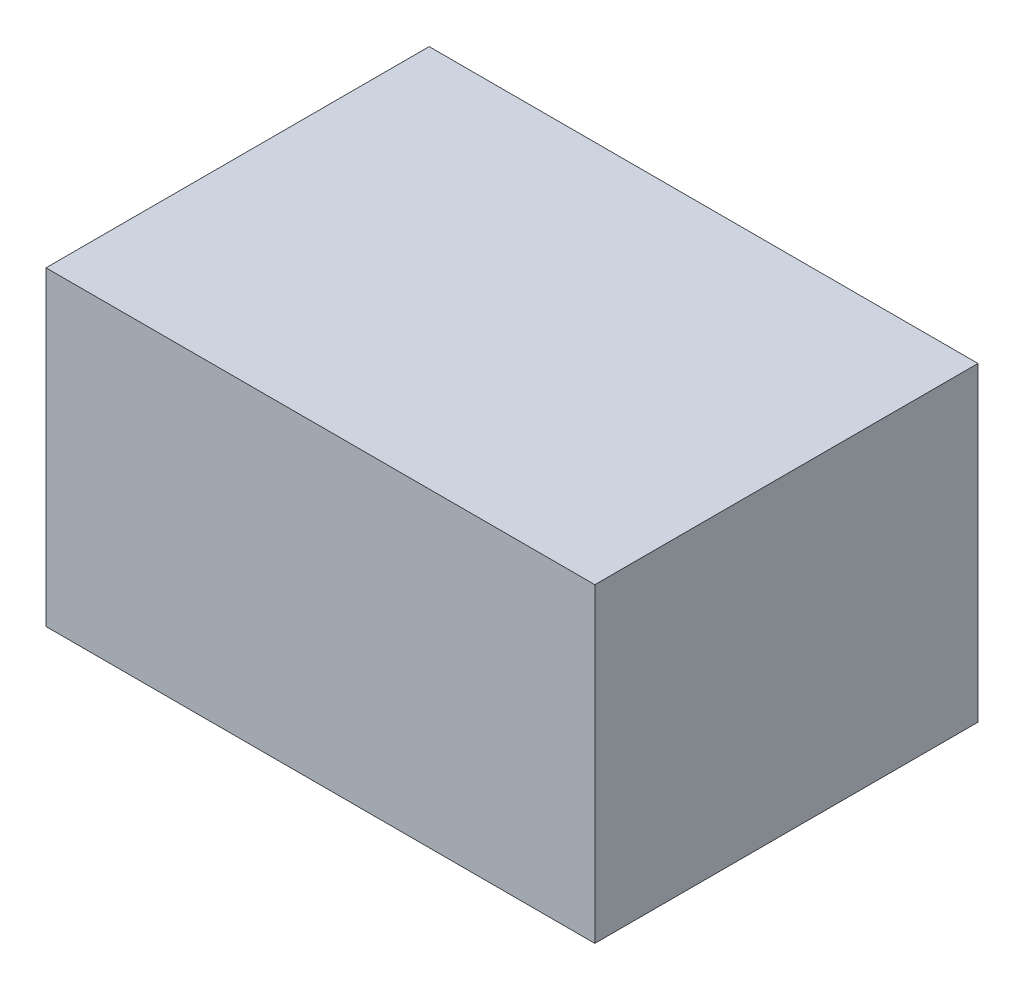
ISO-10303-21;
HEADER;
FILE_DESCRIPTION(('STEP AP214'),'2;1');
FILE_NAME('part.step','',(''),(''),'','','');
FILE_SCHEMA(('AUTOMOTIVE_DESIGN { 1 0 10303 214 1 1 1 1 }'));
ENDSEC;
DATA;
#1=APPLICATION_CONTEXT('core data for automotive mechanical design processes');
#2=APPLICATION_PROTOCOL_DEFINITION('international standard','automotive_design',2000,#1);
#3=PRODUCT_CONTEXT('',#1,'mechanical');
#4=PRODUCT('Part','Part','',(#3));
#5=PRODUCT_RELATED_PRODUCT_CATEGORY('part','',(#4));
#6=PRODUCT_DEFINITION_FORMATION('','',#4);
#7=PRODUCT_DEFINITION_CONTEXT('part definition',#1,'design');
#8=PRODUCT_DEFINITION('design','',#6,#7);
#9=PRODUCT_DEFINITION_SHAPE('','',#8);
#10=(LENGTH_UNIT() NAMED_UNIT(*) SI_UNIT(.MILLI.,.METRE.));
#11=(NAMED_UNIT(*) PLANE_ANGLE_UNIT() SI_UNIT($,.RADIAN.));
#12=(NAMED_UNIT(*) SI_UNIT($,.STERADIAN.) SOLID_ANGLE_UNIT());
#13=UNCERTAINTY_MEASURE_WITH_UNIT(LENGTH_MEASURE(1.E-05),#10,'distance_accuracy_value','');
#14=(GEOMETRIC_REPRESENTATION_CONTEXT(3) GLOBAL_UNCERTAINTY_ASSIGNED_CONTEXT((#13)) GLOBAL_UNIT_ASSIGNED_CONTEXT((#10,
#11,#12)) REPRESENTATION_CONTEXT('',''));
#15=CARTESIAN_POINT('',(0.,0.,0.));
#16=DIRECTION('',(0.,0.,1.));
#17=DIRECTION('',(1.,0.,0.));
#18=AXIS2_PLACEMENT_3D('',#15,#16,#17);
#19=CARTESIAN_POINT('',(132.5,75.,92.5));
#20=DIRECTION('',(-1.,0.,0.));
#21=DIRECTION('',(0.,0.,1.));
#22=AXIS2_PLACEMENT_3D('',#19,#20,#21);
#23=PLANE('',#22);
#24=DIRECTION('',(0.,0.,-1.));
#25=VECTOR('',#24,1.);
#26=CARTESIAN_POINT('',(132.5,-75.,92.5));
#27=LINE('',#26,#25);
#28=CARTESIAN_POINT('',(132.5,-75.,92.5));
#29=VERTEX_POINT('',#28);
#30=CARTESIAN_POINT('',(132.5,-75.,-92.5));
#31=VERTEX_POINT('',#30);
#32=EDGE_CURVE('E96',#29,#31,#27,.T.);
#33=ORIENTED_EDGE('',*,*,#32,.T.);
#34=DIRECTION('',(0.,-1.,0.));
#35=VECTOR('',#34,1.);
#36=CARTESIAN_POINT('',(132.5,75.,-92.5));
#37=LINE('',#36,#35);
#38=CARTESIAN_POINT('',(132.5,75.,-92.5));
#39=VERTEX_POINT('',#38);
#40=EDGE_CURVE('E11',#39,#31,#37,.T.);
#41=ORIENTED_EDGE('',*,*,#40,.F.);
#42=DIRECTION('',(0.,0.,-1.));
#43=VECTOR('',#42,1.);
#44=CARTESIAN_POINT('',(132.5,75.,92.5));
#45=LINE('',#44,#43);
#46=CARTESIAN_POINT('',(132.5,75.,92.5));
#47=VERTEX_POINT('',#46);
#48=EDGE_CURVE('E84',#47,#39,#45,.T.);
#49=ORIENTED_EDGE('',*,*,#48,.F.);
#50=DIRECTION('',(0.,-1.,0.));
#51=VECTOR('',#50,1.);
#52=CARTESIAN_POINT('',(132.5,75.,92.5));
#53=LINE('',#52,#51);
#54=EDGE_CURVE('E92',#47,#29,#53,.T.);
#55=ORIENTED_EDGE('',*,*,#54,.T.);
#56=EDGE_LOOP('',(#33,#41,#49,#55));
#57=FACE_BOUND('',#56,.T.);
#58=ADVANCED_FACE('F33',(#57),#23,.F.);
#59=CARTESIAN_POINT('',(-132.5,75.,-92.5));
#60=DIRECTION('',(0.,0.,1.));
#61=DIRECTION('',(1.,0.,0.));
#62=AXIS2_PLACEMENT_3D('',#59,#60,#61);
#63=PLANE('',#62);
#64=DIRECTION('',(-1.,0.,0.));
#65=VECTOR('',#64,1.);
#66=CARTESIAN_POINT('',(-132.5,-75.,-92.5));
#67=LINE('',#66,#65);
#68=CARTESIAN_POINT('',(-132.5,-75.,-92.5));
#69=VERTEX_POINT('',#68);
#70=EDGE_CURVE('E88',#31,#69,#67,.T.);
#71=ORIENTED_EDGE('',*,*,#70,.T.);
#72=DIRECTION('',(0.,-1.,0.));
#73=VECTOR('',#72,1.);
#74=CARTESIAN_POINT('',(-132.5,75.,-92.5));
#75=LINE('',#74,#73);
#76=CARTESIAN_POINT('',(-132.5,75.,-92.5));
#77=VERTEX_POINT('',#76);
#78=EDGE_CURVE('E41',#77,#69,#75,.T.);
#79=ORIENTED_EDGE('',*,*,#78,.F.);
#80=DIRECTION('',(-1.,0.,0.));
#81=VECTOR('',#80,1.);
#82=CARTESIAN_POINT('',(-132.5,75.,-92.5));
#83=LINE('',#82,#81);
#84=EDGE_CURVE('E79',#39,#77,#83,.T.);
#85=ORIENTED_EDGE('',*,*,#84,.F.);
#86=ORIENTED_EDGE('',*,*,#40,.T.);
#87=EDGE_LOOP('',(#71,#79,#85,#86));
#88=FACE_BOUND('',#87,.T.);
#89=ADVANCED_FACE('F87',(#88),#63,.F.);
#90=CARTESIAN_POINT('',(-132.5,75.,92.5));
#91=DIRECTION('',(1.,0.,0.));
#92=DIRECTION('',(0.,0.,-1.));
#93=AXIS2_PLACEMENT_3D('',#90,#91,#92);
#94=PLANE('',#93);
#95=DIRECTION('',(0.,0.,1.));
#96=VECTOR('',#95,1.);
#97=CARTESIAN_POINT('',(-132.5,-75.,92.5));
#98=LINE('',#97,#96);
#99=CARTESIAN_POINT('',(-132.5,-75.,92.5));
#100=VERTEX_POINT('',#99);
#101=EDGE_CURVE('E66',#69,#100,#98,.T.);
#102=ORIENTED_EDGE('',*,*,#101,.T.);
#103=DIRECTION('',(0.,-1.,0.));
#104=VECTOR('',#103,1.);
#105=CARTESIAN_POINT('',(-132.5,75.,92.5));
#106=LINE('',#105,#104);
#107=CARTESIAN_POINT('',(-132.5,75.,92.5));
#108=VERTEX_POINT('',#107);
#109=EDGE_CURVE('E89',#108,#100,#106,.T.);
#110=ORIENTED_EDGE('',*,*,#109,.F.);
#111=DIRECTION('',(0.,0.,1.));
#112=VECTOR('',#111,1.);
#113=CARTESIAN_POINT('',(-132.5,75.,92.5));
#114=LINE('',#113,#112);
#115=EDGE_CURVE('E82',#77,#108,#114,.T.);
#116=ORIENTED_EDGE('',*,*,#115,.F.);
#117=ORIENTED_EDGE('',*,*,#78,.T.);
#118=EDGE_LOOP('',(#102,#110,#116,#117));
#119=FACE_BOUND('',#118,.T.);
#120=ADVANCED_FACE('F90',(#119),#94,.F.);
#121=CARTESIAN_POINT('',(-132.5,75.,92.5));
#122=DIRECTION('',(0.,0.,-1.));
#123=DIRECTION('',(-1.,0.,0.));
#124=AXIS2_PLACEMENT_3D('',#121,#122,#123);
#125=PLANE('',#124);
#126=DIRECTION('',(1.,0.,0.));
#127=VECTOR('',#126,1.);
#128=CARTESIAN_POINT('',(-132.5,-75.,92.5));
#129=LINE('',#128,#127);
#130=EDGE_CURVE('E72',#100,#29,#129,.T.);
#131=ORIENTED_EDGE('',*,*,#130,.T.);
#132=ORIENTED_EDGE('',*,*,#54,.F.);
#133=DIRECTION('',(1.,0.,0.));
#134=VECTOR('',#133,1.);
#135=CARTESIAN_POINT('',(-132.5,75.,92.5));
#136=LINE('',#135,#134);
#137=EDGE_CURVE('E49',#108,#47,#136,.T.);
#138=ORIENTED_EDGE('',*,*,#137,.F.);
#139=ORIENTED_EDGE('',*,*,#109,.T.);
#140=EDGE_LOOP('',(#131,#132,#138,#139));
#141=FACE_BOUND('',#140,.T.);
#142=ADVANCED_FACE('F103',(#141),#125,.F.);
#143=CARTESIAN_POINT('',(0.,75.,0.));
#144=DIRECTION('',(0.,-1.,0.));
#145=DIRECTION('',(0.,0.,-1.));
#146=AXIS2_PLACEMENT_3D('',#143,#144,#145);
#147=PLANE('',#146);
#148=ORIENTED_EDGE('',*,*,#48,.T.);
#149=ORIENTED_EDGE('',*,*,#84,.T.);
#150=ORIENTED_EDGE('',*,*,#115,.T.);
#151=ORIENTED_EDGE('',*,*,#137,.T.);
#152=EDGE_LOOP('',(#148,#149,#150,#151));
#153=FACE_BOUND('',#152,.T.);
#154=ADVANCED_FACE('F80',(#153),#147,.F.);
#155=CARTESIAN_POINT('',(0.,-75.,0.));
#156=DIRECTION('',(0.,-1.,0.));
#157=DIRECTION('',(0.,0.,-1.));
#158=AXIS2_PLACEMENT_3D('',#155,#156,#157);
#159=PLANE('',#158);
#160=ORIENTED_EDGE('',*,*,#32,.F.);
#161=ORIENTED_EDGE('',*,*,#130,.F.);
#162=ORIENTED_EDGE('',*,*,#101,.F.);
#163=ORIENTED_EDGE('',*,*,#70,.F.);
#164=EDGE_LOOP('',(#160,#161,#162,#163));
#165=FACE_BOUND('',#164,.T.);
#166=ADVANCED_FACE('F106',(#165),#159,.T.);
#167=CLOSED_SHELL('',(#58,#89,#120,#142,#154,#166));
#168=MANIFOLD_SOLID_BREP('B2',#167);
#169=ADVANCED_BREP_SHAPE_REPRESENTATION('',(#18,#168),#14);
#170=SHAPE_DEFINITION_REPRESENTATION(#9,#169);
ENDSEC;
END-ISO-10303-21;
